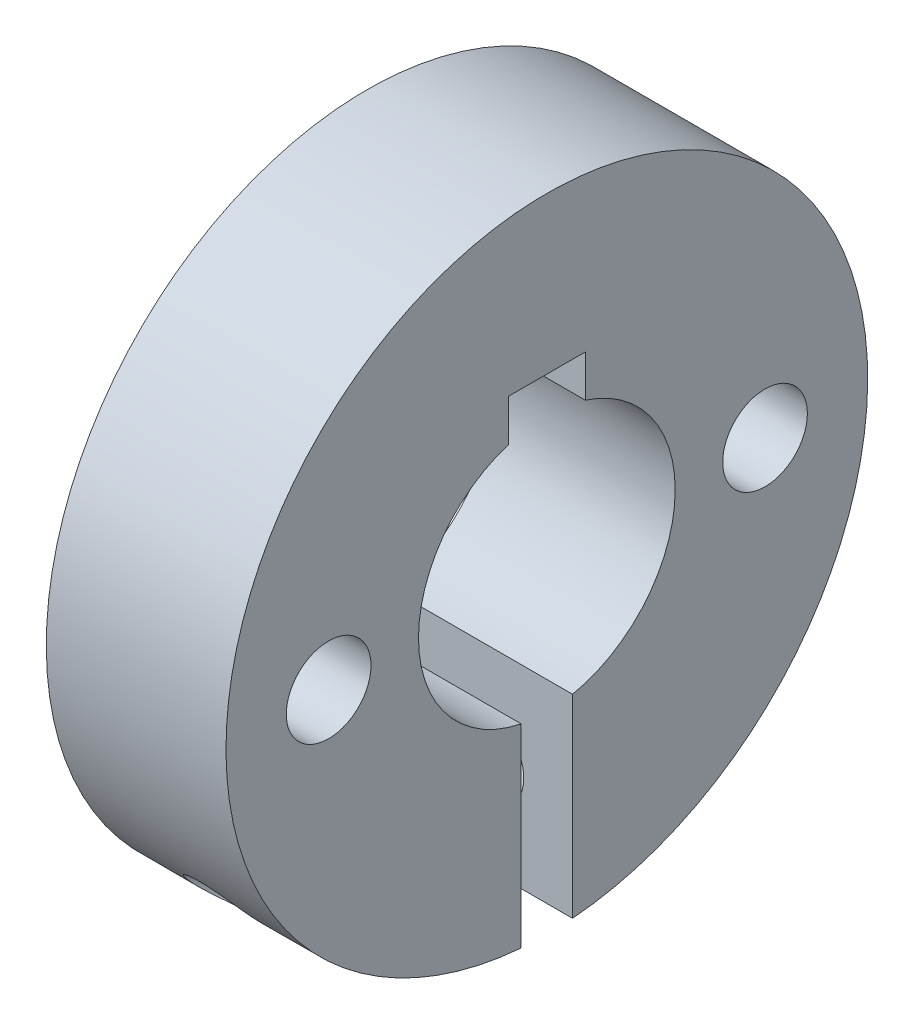
ISO-10303-21;
HEADER;
FILE_DESCRIPTION(('STEP AP214'),'2;1');
FILE_NAME('part.step','',(''),(''),'','','');
FILE_SCHEMA(('AUTOMOTIVE_DESIGN { 1 0 10303 214 1 1 1 1 }'));
ENDSEC;
DATA;
#1=APPLICATION_CONTEXT('core data for automotive mechanical design processes');
#2=APPLICATION_PROTOCOL_DEFINITION('international standard','automotive_design',2000,#1);
#3=PRODUCT_CONTEXT('',#1,'mechanical');
#4=PRODUCT('Part','Part','',(#3));
#5=PRODUCT_RELATED_PRODUCT_CATEGORY('part','',(#4));
#6=PRODUCT_DEFINITION_FORMATION('','',#4);
#7=PRODUCT_DEFINITION_CONTEXT('part definition',#1,'design');
#8=PRODUCT_DEFINITION('design','',#6,#7);
#9=PRODUCT_DEFINITION_SHAPE('','',#8);
#10=(LENGTH_UNIT() NAMED_UNIT(*) SI_UNIT(.MILLI.,.METRE.));
#11=(NAMED_UNIT(*) PLANE_ANGLE_UNIT() SI_UNIT($,.RADIAN.));
#12=(NAMED_UNIT(*) SI_UNIT($,.STERADIAN.) SOLID_ANGLE_UNIT());
#13=UNCERTAINTY_MEASURE_WITH_UNIT(LENGTH_MEASURE(1.E-05),#10,'distance_accuracy_value','');
#14=(GEOMETRIC_REPRESENTATION_CONTEXT(3) GLOBAL_UNCERTAINTY_ASSIGNED_CONTEXT((#13)) GLOBAL_UNIT_ASSIGNED_CONTEXT((#10,
#11,#12)) REPRESENTATION_CONTEXT('',''));
#15=CARTESIAN_POINT('',(0.,0.,0.));
#16=DIRECTION('',(0.,0.,1.));
#17=DIRECTION('',(1.,0.,0.));
#18=AXIS2_PLACEMENT_3D('',#15,#16,#17);
#19=CARTESIAN_POINT('',(7.,0.,0.));
#20=DIRECTION('',(-1.,0.,0.));
#21=DIRECTION('',(0.,0.,1.));
#22=AXIS2_PLACEMENT_3D('',#19,#20,#21);
#23=CYLINDRICAL_SURFACE('',#22,12.5);
#24=CARTESIAN_POINT('',(0.,0.,0.));
#25=DIRECTION('',(1.,0.,0.));
#26=DIRECTION('',(0.,0.,-1.));
#27=AXIS2_PLACEMENT_3D('',#24,#25,#26);
#28=CIRCLE('',#27,12.5);
#29=CARTESIAN_POINT('',(0.,-12.4599357943771,-0.999999999999999));
#30=VERTEX_POINT('',#29);
#31=CARTESIAN_POINT('',(0.,-12.4599357943771,0.999999999999999));
#32=VERTEX_POINT('',#31);
#33=EDGE_CURVE('E160',#30,#32,#28,.T.);
#34=ORIENTED_EDGE('',*,*,#33,.T.);
#35=DIRECTION('',(-1.,0.,0.));
#36=VECTOR('',#35,1.);
#37=CARTESIAN_POINT('',(7.,-12.4599357943771,0.999999999999999));
#38=LINE('',#37,#36);
#39=CARTESIAN_POINT('',(7.,-12.4599357943771,0.999999999999999));
#40=VERTEX_POINT('',#39);
#41=EDGE_CURVE('E194',#40,#32,#38,.T.);
#42=ORIENTED_EDGE('',*,*,#41,.F.);
#43=CARTESIAN_POINT('',(7.,0.,0.));
#44=DIRECTION('',(1.,0.,0.));
#45=DIRECTION('',(0.,0.,-1.));
#46=AXIS2_PLACEMENT_3D('',#43,#44,#45);
#47=CIRCLE('',#46,12.5);
#48=CARTESIAN_POINT('',(7.,-12.4599357943771,-0.999999999999999));
#49=VERTEX_POINT('',#48);
#50=EDGE_CURVE('E108',#49,#40,#47,.T.);
#51=ORIENTED_EDGE('',*,*,#50,.F.);
#52=DIRECTION('',(-1.,0.,0.));
#53=VECTOR('',#52,1.);
#54=CARTESIAN_POINT('',(7.,-12.4599357943771,-0.999999999999999));
#55=LINE('',#54,#53);
#56=EDGE_CURVE('E61',#49,#30,#55,.T.);
#57=ORIENTED_EDGE('',*,*,#56,.T.);
#58=EDGE_LOOP('',(#34,#42,#51,#57));
#59=FACE_BOUND('',#58,.T.);
#60=CARTESIAN_POINT('',(3.5,-7.42945763997174,10.0525200410576));
#61=CARTESIAN_POINT('',(3.55978288655646,-7.42946174926859,10.0525175539705));
#62=CARTESIAN_POINT('',(3.61963217176044,-7.43377704139792,10.0493321604696));
#63=CARTESIAN_POINT('',(3.7375099022843,-7.45077982129552,10.0367318387336));
#64=CARTESIAN_POINT('',(3.79553501221529,-7.4634818056489,10.0273061238871));
#65=CARTESIAN_POINT('',(3.90783155416965,-7.49641794010741,10.0027063484343));
#66=CARTESIAN_POINT('',(3.96211741626726,-7.51662095893979,9.98755604185876));
#67=CARTESIAN_POINT('',(4.06597548915851,-7.56347335897388,9.95212187338343));
#68=CARTESIAN_POINT('',(4.11554819738762,-7.59012205883134,9.93183855406107));
#69=CARTESIAN_POINT('',(4.21202940845868,-7.6504097578195,9.88548200179708));
#70=CARTESIAN_POINT('',(4.25860427714137,-7.68437016451983,9.85913622921956));
#71=CARTESIAN_POINT('',(4.34521100722974,-7.75679212282726,9.80226014095679));
#72=CARTESIAN_POINT('',(4.38523907163008,-7.79525626447128,9.77172741566727));
#73=CARTESIAN_POINT('',(4.47545045211327,-7.89379420771373,9.69245054201375));
#74=CARTESIAN_POINT('',(4.52192178754328,-7.95571395683625,9.64175797585985));
#75=CARTESIAN_POINT('',(4.60133790223953,-8.08344059613538,9.53493416339911));
#76=CARTESIAN_POINT('',(4.6342544086159,-8.14925528690175,9.47879184811337));
#77=CARTESIAN_POINT('',(4.69528660734983,-8.30209022028855,9.34549783292535));
#78=CARTESIAN_POINT('',(4.71914293700325,-8.38965414283765,9.26702345913546));
#79=CARTESIAN_POINT('',(4.74780659058197,-8.56409443836839,9.10606580568194));
#80=CARTESIAN_POINT('',(4.75259975091578,-8.65097025228923,9.02357959133269));
#81=CARTESIAN_POINT('',(4.74473645296879,-8.82333132551455,8.85514487455307));
#82=CARTESIAN_POINT('',(4.73178087671247,-8.90876756928098,8.769161311379));
#83=CARTESIAN_POINT('',(4.68885515944151,-9.07506465388522,8.59694874723722));
#84=CARTESIAN_POINT('',(4.65887897031244,-9.15592385707703,8.51071966987137));
#85=CARTESIAN_POINT('',(4.58484418854808,-9.30560108013872,8.34668729162403));
#86=CARTESIAN_POINT('',(4.54201506503065,-9.37486732858103,8.26873823501817));
#87=CARTESIAN_POINT('',(4.44095566346468,-9.50648911174479,8.11705986168358));
#88=CARTESIAN_POINT('',(4.3827547109875,-9.56885748780057,8.04332283184793));
#89=CARTESIAN_POINT('',(4.27493822008901,-9.6617476182039,7.93118783312109));
#90=CARTESIAN_POINT('',(4.23067301002884,-9.6952728524093,7.89013110944064));
#91=CARTESIAN_POINT('',(4.13507459235188,-9.75761795383695,7.81289532972786));
#92=CARTESIAN_POINT('',(4.08375129602232,-9.78644429754424,7.77670957223794));
#93=CARTESIAN_POINT('',(3.98664145118125,-9.83177665517521,7.71927360404097));
#94=CARTESIAN_POINT('',(3.94237079939095,-9.8495871325264,7.69650999670815));
#95=CARTESIAN_POINT('',(3.84976080595717,-9.8805150969743,7.65676541962036));
#96=CARTESIAN_POINT('',(3.80142771813453,-9.89363963998585,7.63977575753488));
#97=CARTESIAN_POINT('',(3.70977334067508,-9.91246650440011,7.61532718675962));
#98=CARTESIAN_POINT('',(3.66692838428134,-9.91903258335952,7.60676280945789));
#99=CARTESIAN_POINT('',(3.58003005183938,-9.92765510116527,7.59550636327891));
#100=CARTESIAN_POINT('',(3.53597752981058,-9.9297146478674,7.59281024745851));
#101=CARTESIAN_POINT('',(3.44791665251177,-9.92914875239561,7.59355022664115));
#102=CARTESIAN_POINT('',(3.40390837064834,-9.92651916946234,7.59699174150993));
#103=CARTESIAN_POINT('',(3.31724446589245,-9.91679629295766,7.6096788834808));
#104=CARTESIAN_POINT('',(3.27458985918574,-9.90969972562147,7.61892876741003));
#105=CARTESIAN_POINT('',(3.18147013522758,-9.88934591704355,7.64533679304274));
#106=CARTESIAN_POINT('',(3.1316361394873,-9.87500851224983,7.66387316950391));
#107=CARTESIAN_POINT('',(3.03643320370526,-9.84142483243998,7.70695166744678));
#108=CARTESIAN_POINT('',(2.99107263275756,-9.82216958965518,7.73150475716501));
#109=CARTESIAN_POINT('',(2.88531666302246,-9.77012496921136,7.79724992582086));
#110=CARTESIAN_POINT('',(2.82753775794119,-9.73517407189214,7.84091507827152));
#111=CARTESIAN_POINT('',(2.72127066111284,-9.65943348347553,7.93403968968654));
#112=CARTESIAN_POINT('',(2.67280394162761,-9.61863066810989,7.98351212628427));
#113=CARTESIAN_POINT('',(2.56195558794513,-9.51085167006384,8.11195325938806));
#114=CARTESIAN_POINT('',(2.50492900055234,-9.44107306209932,8.19318808229886));
#115=CARTESIAN_POINT('',(2.40815363009991,-9.29435080126215,8.35927073341215));
#116=CARTESIAN_POINT('',(2.36842522614781,-9.21739882621995,8.44412269453566));
#117=CARTESIAN_POINT('',(2.30460753852405,-9.05542611491993,8.61764399098021));
#118=CARTESIAN_POINT('',(2.28107155477115,-8.97022391087228,8.70634747813004));
#119=CARTESIAN_POINT('',(2.25228197462219,-8.79569898398609,8.88262587769882));
#120=CARTESIAN_POINT('',(2.24701841346484,-8.70637853394938,8.97020137928757));
#121=CARTESIAN_POINT('',(2.2557487894639,-8.53460099032578,9.13363175878933));
#122=CARTESIAN_POINT('',(2.26788613799476,-8.45234085574142,9.20978813054695));
#123=CARTESIAN_POINT('',(2.30977755928658,-8.28828090724059,9.35769912865113));
#124=CARTESIAN_POINT('',(2.33951182282192,-8.20648067996324,9.4294586045935));
#125=CARTESIAN_POINT('',(2.40910166645136,-8.06537671091504,9.55019476949637));
#126=CARTESIAN_POINT('',(2.44494930973338,-8.00529535839433,9.60056822444147));
#127=CARTESIAN_POINT('',(2.52868383100547,-7.88943503079477,9.69600001800548));
#128=CARTESIAN_POINT('',(2.57655352257853,-7.83365006121943,9.74106581036351));
#129=CARTESIAN_POINT('',(2.67427907735116,-7.73903570991941,9.81632689502286));
#130=CARTESIAN_POINT('',(2.722035025575,-7.69899743959591,9.84772132475541));
#131=CARTESIAN_POINT('',(2.82529918590666,-7.62527730560836,9.90491403215343));
#132=CARTESIAN_POINT('',(2.88080825013546,-7.59159614159225,9.93071169389863));
#133=CARTESIAN_POINT('',(2.99911912702812,-7.53227156538459,9.97578538225892));
#134=CARTESIAN_POINT('',(3.0619801008126,-7.50670051606314,9.99500281089431));
#135=CARTESIAN_POINT('',(3.19269727986514,-7.46590079840333,10.0255169073047));
#136=CARTESIAN_POINT('',(3.26053875862701,-7.45064290101185,10.0368359632539));
#137=CARTESIAN_POINT('',(3.35765474427614,-7.43726072961347,10.0467492076957));
#138=CARTESIAN_POINT('',(3.38599620704282,-7.43434044308542,10.0489097785977));
#139=CARTESIAN_POINT('',(3.44288672788949,-7.43043792199914,10.0517957854115));
#140=CARTESIAN_POINT('',(3.47143578480231,-7.429455676553,10.0525212293859));
#141=CARTESIAN_POINT('',(3.5,-7.42945763997174,10.0525200410576));
#142=B_SPLINE_CURVE_WITH_KNOTS('',3,(#60,#61,#62,#63,#64,#65,#66,#67,#68,#69,#70,#71,#72,#73,
#74,#75,#76,#77,#78,#79,#80,#81,#82,#83,#84,#85,#86,#87,#88,#89,#90,#91,#92,#93,#94,#95,#96,#97,
#98,#99,#100,#101,#102,#103,#104,#105,#106,#107,#108,#109,#110,#111,#112,#113,#114,#115,#116,
#117,#118,#119,#120,#121,#122,#123,#124,#125,#126,#127,#128,#129,#130,#131,#132,#133,#134,#135,
#136,#137,#138,#139,#140,#141),.UNSPECIFIED.,.T.,.F.,(4,2,2,2,2,2,2,2,2,2,2,2,2,2,2,2,2,2,2,2,2,
2,2,2,2,2,2,2,2,2,2,2,2,2,2,2,2,2,2,2,4),(0.,0.179230290482701,0.358771198428062,
0.537575145236119,0.716360199728705,0.905774907293353,1.09529908470666,1.37138638168006,
1.64804666439201,2.00607658725406,2.36437247026247,2.72878154141975,3.09332018301639,
3.43042677798601,3.76689484657101,3.97355486927007,4.17992759873487,4.33799529664892,
4.49582396789321,4.62779348215124,4.7596719570842,4.8916669456389,5.02375878352867,
5.1880546186204,5.35265221632924,5.59255742107611,5.83300933542669,6.19503931646268,
6.55749466100065,6.93179075746442,7.30588270159683,7.64290494830016,7.97954852156055,
8.23725766093497,8.49460046233357,8.70311900979325,8.91166049294137,9.12201350837459,
9.33176782291982,9.41740439291788,9.50304048180861),.UNSPECIFIED.);
#143=CARTESIAN_POINT('',(3.5,-7.42945763997174,10.0525200410576));
#144=VERTEX_POINT('',#143);
#145=EDGE_CURVE('E161',#144,#144,#142,.T.);
#146=ORIENTED_EDGE('',*,*,#145,.T.);
#147=EDGE_LOOP('',(#146));
#148=FACE_BOUND('',#147,.T.);
#149=CARTESIAN_POINT('',(0.715906380479176,-10.356157588604,-7.));
#150=CARTESIAN_POINT('',(0.79347571941945,-10.4849639310159,-6.8094360780036));
#151=CARTESIAN_POINT('',(0.879114227203295,-10.6069898437073,-6.61755772542862));
#152=CARTESIAN_POINT('',(1.06545459258734,-10.8375851963992,-6.23274193363524));
#153=CARTESIAN_POINT('',(1.16617051017682,-10.9461419014321,-6.03980366953908));
#154=CARTESIAN_POINT('',(1.3285441705624,-11.0987070902661,-5.75156740005704));
#155=CARTESIAN_POINT('',(1.3845235469849,-11.1478301769075,-5.65572784917471));
#156=CARTESIAN_POINT('',(1.50047652009421,-11.2426629423502,-5.4647855329156));
#157=CARTESIAN_POINT('',(1.56044954124828,-11.288373110989,-5.36968266356976));
#158=CARTESIAN_POINT('',(1.68466070415561,-11.3762751946078,-5.18084894386103));
#159=CARTESIAN_POINT('',(1.74889302363027,-11.4184717414562,-5.08711642592867));
#160=CARTESIAN_POINT('',(1.88226803692957,-11.4993035128446,-4.90165614225973));
#161=CARTESIAN_POINT('',(1.95140887156713,-11.5379400731849,-4.8099276345035));
#162=CARTESIAN_POINT('',(2.07155293982641,-11.5992082250827,-4.65967704624451));
#163=CARTESIAN_POINT('',(2.12092312121191,-11.6228830394903,-4.60027481895072));
#164=CARTESIAN_POINT('',(2.22272235608929,-11.6684668723083,-4.48339290348587));
#165=CARTESIAN_POINT('',(2.2751523114519,-11.6903753655164,-4.42591379008868));
#166=CARTESIAN_POINT('',(2.3833954924213,-11.7321693269231,-4.31390315304787));
#167=CARTESIAN_POINT('',(2.43919450652841,-11.7520624586327,-4.259360863849));
#168=CARTESIAN_POINT('',(2.55503832777676,-11.7896432977134,-4.15420497331732));
#169=CARTESIAN_POINT('',(2.61507921193539,-11.807333002085,-4.10358783050333));
#170=CARTESIAN_POINT('',(2.73420525727115,-11.8384875657718,-4.01276563717934));
#171=CARTESIAN_POINT('',(2.79281302168225,-11.8521961714603,-3.97202659616494));
#172=CARTESIAN_POINT('',(2.91485706992919,-11.8769532811491,-3.89737403328445));
#173=CARTESIAN_POINT('',(2.97829189504498,-11.888002584612,-3.86345846059204));
#174=CARTESIAN_POINT('',(3.10035779486694,-11.9052901513401,-3.80982234696773));
#175=CARTESIAN_POINT('',(3.15831019911782,-11.9119984410477,-3.78874378369629));
#176=CARTESIAN_POINT('',(3.27706711920764,-11.922347426304,-3.75605290454492));
#177=CARTESIAN_POINT('',(3.33786568374252,-11.9259942452638,-3.74442169403095));
#178=CARTESIAN_POINT('',(3.46118169662115,-11.9298139921817,-3.73223621294534));
#179=CARTESIAN_POINT('',(3.52370855949574,-11.9299609095258,-3.73176488065797));
#180=CARTESIAN_POINT('',(3.64772265566325,-11.9266933127436,-3.74219319427329));
#181=CARTESIAN_POINT('',(3.70920878035131,-11.9232752173249,-3.75310427456868));
#182=CARTESIAN_POINT('',(3.84024019446919,-11.9123853748738,-3.78753824982327));
#183=CARTESIAN_POINT('',(3.90920727304114,-11.9042874587995,-3.81300007514748));
#184=CARTESIAN_POINT('',(4.04209988578555,-11.8846367505705,-3.87381232771624));
#185=CARTESIAN_POINT('',(4.10601220123495,-11.8730752553772,-3.909187650272));
#186=CARTESIAN_POINT('',(4.22412054495863,-11.8482901139786,-3.98364673837871));
#187=CARTESIAN_POINT('',(4.27868559421665,-11.8352665490465,-4.02222577336096));
#188=CARTESIAN_POINT('',(4.38419956120878,-11.8073429438414,-4.10347520585009));
#189=CARTESIAN_POINT('',(4.435145044631,-11.7924411576966,-4.14614940102825));
#190=CARTESIAN_POINT('',(4.58357285531443,-11.7452716024096,-4.27870846663501));
#191=CARTESIAN_POINT('',(4.6763775176154,-11.7106001649552,-4.37294428753463));
#192=CARTESIAN_POINT('',(4.86859874248035,-11.6294005548317,-4.58499835278535));
#193=CARTESIAN_POINT('',(4.96621300744872,-11.5818611972887,-4.70401374548951));
#194=CARTESIAN_POINT('',(5.15196775562082,-11.4802942724629,-4.94673675331749));
#195=CARTESIAN_POINT('',(5.24009705171786,-11.4262591993242,-5.070449681389));
#196=CARTESIAN_POINT('',(5.40840997976859,-11.3120981016482,-5.32027249000751));
#197=CARTESIAN_POINT('',(5.48859870303995,-11.2519760306366,-5.44638077206397));
#198=CARTESIAN_POINT('',(5.64198918298083,-11.1257283176728,-5.69984496155417));
#199=CARTESIAN_POINT('',(5.71518981577688,-11.0596017133552,-5.82720106605201));
#200=CARTESIAN_POINT('',(5.8806877899506,-10.8959670258562,-6.12921291862304));
#201=CARTESIAN_POINT('',(5.97011318889783,-10.795858936385,-6.30404600407491));
#202=CARTESIAN_POINT('',(6.13660857598588,-10.5844233754347,-6.65294162027726));
#203=CARTESIAN_POINT('',(6.21367263953213,-10.4730905655056,-6.82700374288595));
#204=CARTESIAN_POINT('',(6.35177895545045,-10.2437671074702,-7.16627587090113));
#205=CARTESIAN_POINT('',(6.41332731059465,-10.1262031076222,-7.33156707918228));
#206=CARTESIAN_POINT('',(6.52281833631827,-9.88076331706737,-7.65913985857571));
#207=CARTESIAN_POINT('',(6.57075482662088,-9.75288287605373,-7.82142003141527));
#208=CARTESIAN_POINT('',(6.65106480836704,-9.48724489939785,-8.14158354745148));
#209=CARTESIAN_POINT('',(6.6834491130336,-9.34949430314367,-8.29946987346776));
#210=CARTESIAN_POINT('',(6.73028341826971,-9.06489954867702,-8.60940646452126));
#211=CARTESIAN_POINT('',(6.74474719856136,-8.9180624687207,-8.76146112643365));
#212=CARTESIAN_POINT('',(6.75374233284892,-8.58449012501608,-9.08966053032231));
#213=CARTESIAN_POINT('',(6.74342809503479,-8.39587021316865,-9.26412494928299));
#214=CARTESIAN_POINT('',(6.70078698871932,-8.10773275592281,-9.51477598244882));
#215=CARTESIAN_POINT('',(6.68205920481545,-8.01086278011715,-9.5964518762225));
#216=CARTESIAN_POINT('',(6.63484617075079,-7.81615613511896,-9.75569199092036));
#217=CARTESIAN_POINT('',(6.60636240577516,-7.71831961526695,-9.83325683560889));
#218=CARTESIAN_POINT('',(6.51676916315662,-7.45844353730649,-10.0331017541932));
#219=CARTESIAN_POINT('',(6.44650737009962,-7.29628807996397,-10.1514261578856));
#220=CARTESIAN_POINT('',(6.31792092480426,-7.05772326291356,-10.3173667133299));
#221=CARTESIAN_POINT('',(6.2711619118288,-6.97893881412853,-10.3707813757542));
#222=CARTESIAN_POINT('',(6.16976808784171,-6.82381550856341,-10.4734977709732));
#223=CARTESIAN_POINT('',(6.11513732729465,-6.74747541856254,-10.5228015985552));
#224=CARTESIAN_POINT('',(5.99748150790964,-6.59757272963097,-10.6174370636955));
#225=CARTESIAN_POINT('',(5.93438827556639,-6.52403967587522,-10.6627308790155));
#226=CARTESIAN_POINT('',(5.80037353392708,-6.3815587937478,-10.7486102313954));
#227=CARTESIAN_POINT('',(5.72945601267025,-6.31260865791973,-10.7891981456137));
#228=CARTESIAN_POINT('',(5.58014317064352,-6.18036838978649,-10.8654901339185));
#229=CARTESIAN_POINT('',(5.50174998258859,-6.11707665313437,-10.9011955938755));
#230=CARTESIAN_POINT('',(5.33802039965768,-5.99720676048871,-10.9675980943094));
#231=CARTESIAN_POINT('',(5.25268520080322,-5.94062745213982,-10.9982959947986));
#232=CARTESIAN_POINT('',(5.08815445658085,-5.84253715543178,-11.0506745146717));
#233=CARTESIAN_POINT('',(5.00976347782673,-5.80002520034724,-11.0730156662818));
#234=CARTESIAN_POINT('',(4.8489155386437,-5.72125748740897,-11.1139184443795));
#235=CARTESIAN_POINT('',(4.76645726408655,-5.6850037688188,-11.1324788392506));
#236=CARTESIAN_POINT('',(4.59820179605341,-5.61929446776873,-11.1657910795414));
#237=CARTESIAN_POINT('',(4.51240728342034,-5.5898335536625,-11.1805459130183));
#238=CARTESIAN_POINT('',(4.3381255834925,-5.53806831592891,-11.2062761029865));
#239=CARTESIAN_POINT('',(4.2496374672943,-5.51576649247639,-11.2172501392049));
#240=CARTESIAN_POINT('',(3.9957723438197,-5.46312310043207,-11.2430339136334));
#241=CARTESIAN_POINT('',(3.82797988145904,-5.44165505392729,-11.2533765726616));
#242=CARTESIAN_POINT('',(3.49091402445433,-5.42508750353382,-11.2613720659369));
#243=CARTESIAN_POINT('',(3.32164098585682,-5.42998182516045,-11.2590278716455));
#244=CARTESIAN_POINT('',(2.99043215235368,-5.46543808271563,-11.2418571308996));
#245=CARTESIAN_POINT('',(2.82841723578411,-5.49540225442743,-11.2273212623124));
#246=CARTESIAN_POINT('',(2.51222542758918,-5.57888628807904,-11.1860705681646));
#247=CARTESIAN_POINT('',(2.35804817915064,-5.63240507661171,-11.1593562975839));
#248=CARTESIAN_POINT('',(2.0603129655649,-5.76118181851466,-11.0934227984173));
#249=CARTESIAN_POINT('',(1.91685807015789,-5.83662330511915,-11.0540976936244));
#250=CARTESIAN_POINT('',(1.64547687620747,-6.00572973162655,-10.9631381595828));
#251=CARTESIAN_POINT('',(1.51755225038437,-6.09939663171304,-10.9115024061618));
#252=CARTESIAN_POINT('',(1.27442846853792,-6.305467715642,-10.7937818088803));
#253=CARTESIAN_POINT('',(1.16003549154584,-6.41851438608942,-10.7271617519652));
#254=CARTESIAN_POINT('',(0.952271905730735,-6.65549003745732,-10.5817661507352));
#255=CARTESIAN_POINT('',(0.858906614363124,-6.7794217599881,-10.502987540249));
#256=CARTESIAN_POINT('',(0.68513754406606,-7.04639633920461,-10.3260061508724));
#257=CARTESIAN_POINT('',(0.606955690721397,-7.19011239883077,-10.226649660437));
#258=CARTESIAN_POINT('',(0.47510589525642,-7.48030795178657,-10.0163433684595));
#259=CARTESIAN_POINT('',(0.421456593317924,-7.62678945864233,-9.9053848299024));
#260=CARTESIAN_POINT('',(0.347593493002063,-7.88097079415301,-9.70358271136463));
#261=CARTESIAN_POINT('',(0.322331615330954,-7.9889710196087,-9.61488972844366));
#262=CARTESIAN_POINT('',(0.283250983673566,-8.20314260500007,-9.43282552453337));
#263=CARTESIAN_POINT('',(0.269436643254899,-8.30931324411015,-9.33945251387154));
#264=CARTESIAN_POINT('',(0.252259125874545,-8.51896627205994,-9.14862495710288));
#265=CARTESIAN_POINT('',(0.248907368940249,-8.62244560126541,-9.05116606867595));
#266=CARTESIAN_POINT('',(0.251708688048735,-8.82595913749987,-8.85283270471409));
#267=CARTESIAN_POINT('',(0.257864152075369,-8.92599247252625,-8.75195737727741));
#268=CARTESIAN_POINT('',(0.281642472814555,-9.1489930375392,-8.51930193839648));
#269=CARTESIAN_POINT('',(0.301943969902885,-9.27073916036144,-8.38662332767934));
#270=CARTESIAN_POINT('',(0.354850912990131,-9.50724230785035,-8.11754014683597));
#271=CARTESIAN_POINT('',(0.387459804537605,-9.62199736485663,-7.98113454323874));
#272=CARTESIAN_POINT('',(0.463681018685927,-9.84441190030902,-7.70513048308187));
#273=CARTESIAN_POINT('',(0.507318154565076,-9.95205467800057,-7.5655254807959));
#274=CARTESIAN_POINT('',(0.60443643081566,-10.1597801320075,-7.28419170754691));
#275=CARTESIAN_POINT('',(0.657916529953154,-10.2598636064029,-7.14246316267737));
#276=CARTESIAN_POINT('',(0.715906380479176,-10.356157588604,-7.));
#277=B_SPLINE_CURVE_WITH_KNOTS('',3,(#149,#150,#151,#152,#153,#154,#155,#156,#157,#158,#159,
#160,#161,#162,#163,#164,#165,#166,#167,#168,#169,#170,#171,#172,#173,#174,#175,#176,#177,#178,
#179,#180,#181,#182,#183,#184,#185,#186,#187,#188,#189,#190,#191,#192,#193,#194,#195,#196,#197,
#198,#199,#200,#201,#202,#203,#204,#205,#206,#207,#208,#209,#210,#211,#212,#213,#214,#215,#216,
#217,#218,#219,#220,#221,#222,#223,#224,#225,#226,#227,#228,#229,#230,#231,#232,#233,#234,#235,
#236,#237,#238,#239,#240,#241,#242,#243,#244,#245,#246,#247,#248,#249,#250,#251,#252,#253,#254,
#255,#256,#257,#258,#259,#260,#261,#262,#263,#264,#265,#266,#267,#268,#269,#270,#271,#272,#273,
#274,#275,#276),.UNSPECIFIED.,.T.,.F.,(4,2,2,2,2,2,2,2,2,2,2,2,2,2,2,2,2,2,2,2,2,2,2,2,2,2,2,2,
2,2,2,2,2,2,2,2,2,2,2,2,2,2,2,2,2,2,2,2,2,2,2,2,2,2,2,2,2,2,2,2,2,2,2,4),(0.,0.728057558935906,
1.45679832486738,1.82083241906029,2.18481416457924,2.54830822970694,2.91166534211385,
3.15394756558886,3.39630156619656,3.63769638322076,3.87887080337769,4.09653484282755,
4.31413336424747,4.49952498259802,4.68454489975767,4.87093942478619,5.05752137602643,
5.27816926712885,5.49937630459202,5.70332323497106,5.90746115887548,6.31672473447687,
6.79943494025892,7.28270838245376,7.76566992641712,8.24870901323374,8.90931756109835,
9.57024178830179,10.2054910897099,10.8410283576706,11.4761231031598,12.1107291982555,
12.8791374296577,13.2630038263927,13.6468118118347,14.2817904778067,14.5996201240857,
14.9172868090056,15.2376864088655,15.5579234490161,15.8780694012824,16.1981603127529,
16.4735912244917,16.7491117174247,17.0244152135646,17.2998147498266,17.8055244914848,
18.3111157930529,18.8049843810883,19.2988304653741,19.796936309821,20.2950957562961,
20.8151450520335,21.3353257099083,21.9073947874947,22.4798978119994,22.9054003823637,
23.3310669278887,23.7571979310547,24.1834359854249,24.7263949436425,25.2695060202316,
25.8138501350839,26.3581366997733),.UNSPECIFIED.);
#278=CARTESIAN_POINT('',(0.715906380479176,-10.356157588604,-7.));
#279=VERTEX_POINT('',#278);
#280=EDGE_CURVE('E11',#279,#279,#277,.T.);
#281=ORIENTED_EDGE('',*,*,#280,.T.);
#282=EDGE_LOOP('',(#281));
#283=FACE_BOUND('',#282,.T.);
#284=ADVANCED_FACE('F47',(#59,#148,#283),#23,.T.);
#285=CARTESIAN_POINT('',(7.,0.,-1.));
#286=DIRECTION('',(0.,0.,-1.));
#287=DIRECTION('',(0.,1.,0.));
#288=AXIS2_PLACEMENT_3D('',#285,#286,#287);
#289=PLANE('',#288);
#290=CARTESIAN_POINT('',(3.5,-8.67945763997173,-1.));
#291=DIRECTION('',(0.,0.,-1.));
#292=DIRECTION('',(0.,1.,0.));
#293=AXIS2_PLACEMENT_3D('',#290,#291,#292);
#294=CIRCLE('',#293,1.6);
#295=CARTESIAN_POINT('',(3.5,-7.07945763997173,-1.));
#296=VERTEX_POINT('',#295);
#297=EDGE_CURVE('E283',#296,#296,#294,.F.);
#298=ORIENTED_EDGE('',*,*,#297,.F.);
#299=EDGE_LOOP('',(#298));
#300=FACE_BOUND('',#299,.T.);
#301=DIRECTION('',(0.,-1.,0.));
#302=VECTOR('',#301,1.);
#303=CARTESIAN_POINT('',(0.,0.,-1.));
#304=LINE('',#303,#302);
#305=CARTESIAN_POINT('',(0.,-4.89897948556636,-1.));
#306=VERTEX_POINT('',#305);
#307=EDGE_CURVE('E157',#306,#30,#304,.T.);
#308=ORIENTED_EDGE('',*,*,#307,.T.);
#309=ORIENTED_EDGE('',*,*,#56,.F.);
#310=DIRECTION('',(0.,-1.,0.));
#311=VECTOR('',#310,1.);
#312=CARTESIAN_POINT('',(7.,0.,-1.));
#313=LINE('',#312,#311);
#314=CARTESIAN_POINT('',(7.,-4.89897948556636,-1.));
#315=VERTEX_POINT('',#314);
#316=EDGE_CURVE('E293',#315,#49,#313,.T.);
#317=ORIENTED_EDGE('',*,*,#316,.F.);
#318=DIRECTION('',(-1.,0.,0.));
#319=VECTOR('',#318,1.);
#320=CARTESIAN_POINT('',(7.,-4.89897948556636,-1.));
#321=LINE('',#320,#319);
#322=EDGE_CURVE('E69',#315,#306,#321,.T.);
#323=ORIENTED_EDGE('',*,*,#322,.T.);
#324=EDGE_LOOP('',(#308,#309,#317,#323));
#325=FACE_BOUND('',#324,.T.);
#326=ADVANCED_FACE('F49',(#300,#325),#289,.F.);
#327=CARTESIAN_POINT('',(7.,0.,1.));
#328=DIRECTION('',(0.,0.,-1.));
#329=DIRECTION('',(0.,1.,0.));
#330=AXIS2_PLACEMENT_3D('',#327,#328,#329);
#331=PLANE('',#330);
#332=CARTESIAN_POINT('',(3.5,-8.67945763997174,1.));
#333=DIRECTION('',(0.,0.,-1.));
#334=DIRECTION('',(0.,1.,0.));
#335=AXIS2_PLACEMENT_3D('',#332,#333,#334);
#336=CIRCLE('',#335,1.25);
#337=CARTESIAN_POINT('',(3.5,-7.42945763997174,1.));
#338=VERTEX_POINT('',#337);
#339=EDGE_CURVE('E204',#338,#338,#336,.T.);
#340=ORIENTED_EDGE('',*,*,#339,.F.);
#341=EDGE_LOOP('',(#340));
#342=FACE_BOUND('',#341,.T.);
#343=DIRECTION('',(0.,-1.,0.));
#344=VECTOR('',#343,1.);
#345=CARTESIAN_POINT('',(0.,0.,1.));
#346=LINE('',#345,#344);
#347=CARTESIAN_POINT('',(0.,-4.89897948556636,1.));
#348=VERTEX_POINT('',#347);
#349=EDGE_CURVE('E165',#348,#32,#346,.T.);
#350=ORIENTED_EDGE('',*,*,#349,.F.);
#351=DIRECTION('',(-1.,0.,0.));
#352=VECTOR('',#351,1.);
#353=CARTESIAN_POINT('',(7.,-4.89897948556636,1.));
#354=LINE('',#353,#352);
#355=CARTESIAN_POINT('',(7.,-4.89897948556636,1.));
#356=VERTEX_POINT('',#355);
#357=EDGE_CURVE('E191',#356,#348,#354,.T.);
#358=ORIENTED_EDGE('',*,*,#357,.F.);
#359=DIRECTION('',(0.,-1.,0.));
#360=VECTOR('',#359,1.);
#361=CARTESIAN_POINT('',(7.,0.,1.));
#362=LINE('',#361,#360);
#363=EDGE_CURVE('E298',#356,#40,#362,.T.);
#364=ORIENTED_EDGE('',*,*,#363,.T.);
#365=ORIENTED_EDGE('',*,*,#41,.T.);
#366=EDGE_LOOP('',(#350,#358,#364,#365));
#367=FACE_BOUND('',#366,.T.);
#368=ADVANCED_FACE('F234',(#342,#367),#331,.T.);
#369=CARTESIAN_POINT('',(7.,0.,0.));
#370=DIRECTION('',(-1.,0.,0.));
#371=DIRECTION('',(0.,0.,1.));
#372=AXIS2_PLACEMENT_3D('',#369,#370,#371);
#373=CYLINDRICAL_SURFACE('',#372,5.);
#374=CARTESIAN_POINT('',(0.,0.,0.));
#375=DIRECTION('',(1.,0.,0.));
#376=DIRECTION('',(0.,0.,-1.));
#377=AXIS2_PLACEMENT_3D('',#374,#375,#376);
#378=CIRCLE('',#377,5.);
#379=CARTESIAN_POINT('',(0.,4.76969600708473,1.5));
#380=VERTEX_POINT('',#379);
#381=EDGE_CURVE('E169',#380,#348,#378,.T.);
#382=ORIENTED_EDGE('',*,*,#381,.F.);
#383=DIRECTION('',(-1.,0.,0.));
#384=VECTOR('',#383,1.);
#385=CARTESIAN_POINT('',(7.,4.76969600708473,1.5));
#386=LINE('',#385,#384);
#387=CARTESIAN_POINT('',(7.,4.76969600708473,1.5));
#388=VERTEX_POINT('',#387);
#389=EDGE_CURVE('E188',#388,#380,#386,.T.);
#390=ORIENTED_EDGE('',*,*,#389,.F.);
#391=CARTESIAN_POINT('',(7.,0.,0.));
#392=DIRECTION('',(1.,0.,0.));
#393=DIRECTION('',(0.,0.,-1.));
#394=AXIS2_PLACEMENT_3D('',#391,#392,#393);
#395=CIRCLE('',#394,5.);
#396=EDGE_CURVE('E154',#388,#356,#395,.T.);
#397=ORIENTED_EDGE('',*,*,#396,.T.);
#398=ORIENTED_EDGE('',*,*,#357,.T.);
#399=EDGE_LOOP('',(#382,#390,#397,#398));
#400=FACE_BOUND('',#399,.T.);
#401=ADVANCED_FACE('F226',(#400),#373,.F.);
#402=CARTESIAN_POINT('',(7.,0.,1.5));
#403=DIRECTION('',(0.,0.,1.));
#404=DIRECTION('',(0.,-1.,0.));
#405=AXIS2_PLACEMENT_3D('',#402,#403,#404);
#406=PLANE('',#405);
#407=DIRECTION('',(0.,1.,0.));
#408=VECTOR('',#407,1.);
#409=CARTESIAN_POINT('',(0.,0.,1.5));
#410=LINE('',#409,#408);
#411=CARTESIAN_POINT('',(0.,6.4,1.5));
#412=VERTEX_POINT('',#411);
#413=EDGE_CURVE('E173',#380,#412,#410,.T.);
#414=ORIENTED_EDGE('',*,*,#413,.T.);
#415=DIRECTION('',(-1.,0.,0.));
#416=VECTOR('',#415,1.);
#417=CARTESIAN_POINT('',(7.,6.4,1.5));
#418=LINE('',#417,#416);
#419=CARTESIAN_POINT('',(7.,6.4,1.5));
#420=VERTEX_POINT('',#419);
#421=EDGE_CURVE('E146',#420,#412,#418,.T.);
#422=ORIENTED_EDGE('',*,*,#421,.F.);
#423=DIRECTION('',(0.,1.,0.));
#424=VECTOR('',#423,1.);
#425=CARTESIAN_POINT('',(7.,0.,1.5));
#426=LINE('',#425,#424);
#427=EDGE_CURVE('E132',#388,#420,#426,.T.);
#428=ORIENTED_EDGE('',*,*,#427,.F.);
#429=ORIENTED_EDGE('',*,*,#389,.T.);
#430=EDGE_LOOP('',(#414,#422,#428,#429));
#431=FACE_BOUND('',#430,.T.);
#432=ADVANCED_FACE('F231',(#431),#406,.F.);
#433=CARTESIAN_POINT('',(7.,6.4,0.));
#434=DIRECTION('',(0.,1.,0.));
#435=DIRECTION('',(0.,0.,1.));
#436=AXIS2_PLACEMENT_3D('',#433,#434,#435);
#437=PLANE('',#436);
#438=DIRECTION('',(0.,0.,-1.));
#439=VECTOR('',#438,1.);
#440=CARTESIAN_POINT('',(0.,6.4,0.));
#441=LINE('',#440,#439);
#442=CARTESIAN_POINT('',(0.,6.4,-1.5));
#443=VERTEX_POINT('',#442);
#444=EDGE_CURVE('E142',#412,#443,#441,.T.);
#445=ORIENTED_EDGE('',*,*,#444,.T.);
#446=DIRECTION('',(-1.,0.,0.));
#447=VECTOR('',#446,1.);
#448=CARTESIAN_POINT('',(7.,6.4,-1.5));
#449=LINE('',#448,#447);
#450=CARTESIAN_POINT('',(7.,6.4,-1.5));
#451=VERTEX_POINT('',#450);
#452=EDGE_CURVE('E139',#451,#443,#449,.T.);
#453=ORIENTED_EDGE('',*,*,#452,.F.);
#454=DIRECTION('',(0.,0.,-1.));
#455=VECTOR('',#454,1.);
#456=CARTESIAN_POINT('',(7.,6.4,0.));
#457=LINE('',#456,#455);
#458=EDGE_CURVE('E124',#420,#451,#457,.T.);
#459=ORIENTED_EDGE('',*,*,#458,.F.);
#460=ORIENTED_EDGE('',*,*,#421,.T.);
#461=EDGE_LOOP('',(#445,#453,#459,#460));
#462=FACE_BOUND('',#461,.T.);
#463=ADVANCED_FACE('F140',(#462),#437,.F.);
#464=CARTESIAN_POINT('',(7.,0.,-1.5));
#465=DIRECTION('',(0.,0.,1.));
#466=DIRECTION('',(0.,-1.,0.));
#467=AXIS2_PLACEMENT_3D('',#464,#465,#466);
#468=PLANE('',#467);
#469=DIRECTION('',(0.,1.,0.));
#470=VECTOR('',#469,1.);
#471=CARTESIAN_POINT('',(0.,0.,-1.5));
#472=LINE('',#471,#470);
#473=CARTESIAN_POINT('',(0.,4.76969600708473,-1.5));
#474=VERTEX_POINT('',#473);
#475=EDGE_CURVE('E179',#474,#443,#472,.T.);
#476=ORIENTED_EDGE('',*,*,#475,.F.);
#477=DIRECTION('',(-1.,0.,0.));
#478=VECTOR('',#477,1.);
#479=CARTESIAN_POINT('',(7.,4.76969600708473,-1.5));
#480=LINE('',#479,#478);
#481=CARTESIAN_POINT('',(7.,4.76969600708473,-1.5));
#482=VERTEX_POINT('',#481);
#483=EDGE_CURVE('E95',#482,#474,#480,.T.);
#484=ORIENTED_EDGE('',*,*,#483,.F.);
#485=DIRECTION('',(0.,1.,0.));
#486=VECTOR('',#485,1.);
#487=CARTESIAN_POINT('',(7.,0.,-1.5));
#488=LINE('',#487,#486);
#489=EDGE_CURVE('E129',#482,#451,#488,.T.);
#490=ORIENTED_EDGE('',*,*,#489,.T.);
#491=ORIENTED_EDGE('',*,*,#452,.T.);
#492=EDGE_LOOP('',(#476,#484,#490,#491));
#493=FACE_BOUND('',#492,.T.);
#494=ADVANCED_FACE('F148',(#493),#468,.T.);
#495=EDGE_CURVE('E174',#306,#474,#378,.T.);
#496=ORIENTED_EDGE('',*,*,#495,.F.);
#497=ORIENTED_EDGE('',*,*,#322,.F.);
#498=EDGE_CURVE('E150',#315,#482,#395,.T.);
#499=ORIENTED_EDGE('',*,*,#498,.T.);
#500=ORIENTED_EDGE('',*,*,#483,.T.);
#501=EDGE_LOOP('',(#496,#497,#499,#500));
#502=FACE_BOUND('',#501,.T.);
#503=ADVANCED_FACE('F219',(#502),#373,.F.);
#504=CARTESIAN_POINT('',(7.,0.,0.));
#505=DIRECTION('',(1.,0.,0.));
#506=DIRECTION('',(0.,0.,-1.));
#507=AXIS2_PLACEMENT_3D('',#504,#505,#506);
#508=PLANE('',#507);
#509=CARTESIAN_POINT('',(7.,0.,-8.5));
#510=DIRECTION('',(1.,0.,0.));
#511=DIRECTION('',(0.,0.,-1.));
#512=AXIS2_PLACEMENT_3D('',#509,#510,#511);
#513=CIRCLE('',#512,1.65);
#514=CARTESIAN_POINT('',(7.,0.,-10.15));
#515=VERTEX_POINT('',#514);
#516=EDGE_CURVE('E325',#515,#515,#513,.T.);
#517=ORIENTED_EDGE('',*,*,#516,.F.);
#518=EDGE_LOOP('',(#517));
#519=FACE_BOUND('',#518,.T.);
#520=CARTESIAN_POINT('',(7.,0.,8.5));
#521=DIRECTION('',(1.,0.,0.));
#522=DIRECTION('',(0.,0.,-1.));
#523=AXIS2_PLACEMENT_3D('',#520,#521,#522);
#524=CIRCLE('',#523,1.65);
#525=CARTESIAN_POINT('',(7.,0.,6.85));
#526=VERTEX_POINT('',#525);
#527=EDGE_CURVE('E286',#526,#526,#524,.T.);
#528=ORIENTED_EDGE('',*,*,#527,.F.);
#529=EDGE_LOOP('',(#528));
#530=FACE_BOUND('',#529,.T.);
#531=ORIENTED_EDGE('',*,*,#316,.T.);
#532=ORIENTED_EDGE('',*,*,#50,.T.);
#533=ORIENTED_EDGE('',*,*,#363,.F.);
#534=ORIENTED_EDGE('',*,*,#396,.F.);
#535=ORIENTED_EDGE('',*,*,#427,.T.);
#536=ORIENTED_EDGE('',*,*,#458,.T.);
#537=ORIENTED_EDGE('',*,*,#489,.F.);
#538=ORIENTED_EDGE('',*,*,#498,.F.);
#539=EDGE_LOOP('',(#531,#532,#533,#534,#535,#536,#537,#538));
#540=FACE_BOUND('',#539,.T.);
#541=ADVANCED_FACE('F126',(#519,#530,#540),#508,.T.);
#542=CARTESIAN_POINT('',(0.,0.,0.));
#543=DIRECTION('',(1.,0.,0.));
#544=DIRECTION('',(0.,0.,-1.));
#545=AXIS2_PLACEMENT_3D('',#542,#543,#544);
#546=PLANE('',#545);
#547=CARTESIAN_POINT('',(0.,0.,-8.5));
#548=DIRECTION('',(1.,0.,0.));
#549=DIRECTION('',(0.,0.,-1.));
#550=AXIS2_PLACEMENT_3D('',#547,#548,#549);
#551=CIRCLE('',#550,1.65);
#552=CARTESIAN_POINT('',(0.,0.,-10.15));
#553=VERTEX_POINT('',#552);
#554=EDGE_CURVE('E321',#553,#553,#551,.T.);
#555=ORIENTED_EDGE('',*,*,#554,.T.);
#556=EDGE_LOOP('',(#555));
#557=FACE_BOUND('',#556,.T.);
#558=CARTESIAN_POINT('',(0.,0.,8.5));
#559=DIRECTION('',(1.,0.,0.));
#560=DIRECTION('',(0.,0.,-1.));
#561=AXIS2_PLACEMENT_3D('',#558,#559,#560);
#562=CIRCLE('',#561,1.65);
#563=CARTESIAN_POINT('',(0.,0.,6.85));
#564=VERTEX_POINT('',#563);
#565=EDGE_CURVE('E279',#564,#564,#562,.T.);
#566=ORIENTED_EDGE('',*,*,#565,.T.);
#567=EDGE_LOOP('',(#566));
#568=FACE_BOUND('',#567,.T.);
#569=ORIENTED_EDGE('',*,*,#307,.F.);
#570=ORIENTED_EDGE('',*,*,#495,.T.);
#571=ORIENTED_EDGE('',*,*,#475,.T.);
#572=ORIENTED_EDGE('',*,*,#444,.F.);
#573=ORIENTED_EDGE('',*,*,#413,.F.);
#574=ORIENTED_EDGE('',*,*,#381,.T.);
#575=ORIENTED_EDGE('',*,*,#349,.T.);
#576=ORIENTED_EDGE('',*,*,#33,.F.);
#577=EDGE_LOOP('',(#569,#570,#571,#572,#573,#574,#575,#576));
#578=FACE_BOUND('',#577,.T.);
#579=ADVANCED_FACE('F213',(#557,#568,#578),#546,.F.);
#580=CARTESIAN_POINT('',(3.5,-8.67945763997174,1.));
#581=DIRECTION('',(0.,0.,-1.));
#582=DIRECTION('',(0.,1.,0.));
#583=AXIS2_PLACEMENT_3D('',#580,#581,#582);
#584=CYLINDRICAL_SURFACE('',#583,1.25);
#585=ORIENTED_EDGE('',*,*,#339,.T.);
#586=EDGE_LOOP('',(#585));
#587=FACE_BOUND('',#586,.T.);
#588=ORIENTED_EDGE('',*,*,#145,.F.);
#589=EDGE_LOOP('',(#588));
#590=FACE_BOUND('',#589,.T.);
#591=ADVANCED_FACE('F207',(#587,#590),#584,.F.);
#592=CARTESIAN_POINT('',(3.5,-8.67945763997173,-7.));
#593=DIRECTION('',(0.,0.,-1.));
#594=DIRECTION('',(0.,1.,0.));
#595=AXIS2_PLACEMENT_3D('',#592,#593,#594);
#596=CYLINDRICAL_SURFACE('',#595,3.25);
#597=CARTESIAN_POINT('',(3.5,-8.67945763997173,-3.6));
#598=DIRECTION('',(0.,0.,-1.));
#599=DIRECTION('',(0.,1.,0.));
#600=AXIS2_PLACEMENT_3D('',#597,#598,#599);
#601=CIRCLE('',#600,3.25);
#602=CARTESIAN_POINT('',(3.5,-5.42945763997174,-3.6));
#603=VERTEX_POINT('',#602);
#604=EDGE_CURVE('E277',#603,#603,#601,.T.);
#605=ORIENTED_EDGE('',*,*,#604,.F.);
#606=EDGE_LOOP('',(#605));
#607=FACE_BOUND('',#606,.T.);
#608=ORIENTED_EDGE('',*,*,#280,.F.);
#609=EDGE_LOOP('',(#608));
#610=FACE_BOUND('',#609,.T.);
#611=ADVANCED_FACE('F212',(#607,#610),#596,.F.);
#612=CARTESIAN_POINT('',(3.5,-8.67945763997173,-7.));
#613=DIRECTION('',(0.,0.,-1.));
#614=DIRECTION('',(0.,1.,0.));
#615=AXIS2_PLACEMENT_3D('',#612,#613,#614);
#616=CYLINDRICAL_SURFACE('',#615,1.6);
#617=ORIENTED_EDGE('',*,*,#297,.T.);
#618=EDGE_LOOP('',(#617));
#619=FACE_BOUND('',#618,.T.);
#620=CARTESIAN_POINT('',(3.5,-8.67945763997173,-3.6));
#621=DIRECTION('',(0.,0.,-1.));
#622=DIRECTION('',(0.,1.,0.));
#623=AXIS2_PLACEMENT_3D('',#620,#621,#622);
#624=CIRCLE('',#623,1.6);
#625=CARTESIAN_POINT('',(3.5,-7.07945763997173,-3.6));
#626=VERTEX_POINT('',#625);
#627=EDGE_CURVE('E275',#626,#626,#624,.T.);
#628=ORIENTED_EDGE('',*,*,#627,.T.);
#629=EDGE_LOOP('',(#628));
#630=FACE_BOUND('',#629,.T.);
#631=ADVANCED_FACE('F215',(#619,#630),#616,.F.);
#632=CARTESIAN_POINT('',(5.1,-8.67945763997173,-3.6));
#633=DIRECTION('',(0.,0.,1.));
#634=DIRECTION('',(0.,-1.,0.));
#635=AXIS2_PLACEMENT_3D('',#632,#633,#634);
#636=PLANE('',#635);
#637=ORIENTED_EDGE('',*,*,#627,.F.);
#638=EDGE_LOOP('',(#637));
#639=FACE_BOUND('',#638,.T.);
#640=ORIENTED_EDGE('',*,*,#604,.T.);
#641=EDGE_LOOP('',(#640));
#642=FACE_BOUND('',#641,.T.);
#643=ADVANCED_FACE('F259',(#639,#642),#636,.F.);
#644=CARTESIAN_POINT('',(7.,0.,8.5));
#645=DIRECTION('',(1.,0.,0.));
#646=DIRECTION('',(0.,0.,-1.));
#647=AXIS2_PLACEMENT_3D('',#644,#645,#646);
#648=CYLINDRICAL_SURFACE('',#647,1.65);
#649=ORIENTED_EDGE('',*,*,#565,.F.);
#650=EDGE_LOOP('',(#649));
#651=FACE_BOUND('',#650,.T.);
#652=ORIENTED_EDGE('',*,*,#527,.T.);
#653=EDGE_LOOP('',(#652));
#654=FACE_BOUND('',#653,.T.);
#655=ADVANCED_FACE('F264',(#651,#654),#648,.F.);
#656=CARTESIAN_POINT('',(7.,0.,-8.5));
#657=DIRECTION('',(1.,0.,0.));
#658=DIRECTION('',(0.,0.,-1.));
#659=AXIS2_PLACEMENT_3D('',#656,#657,#658);
#660=CYLINDRICAL_SURFACE('',#659,1.65);
#661=ORIENTED_EDGE('',*,*,#554,.F.);
#662=EDGE_LOOP('',(#661));
#663=FACE_BOUND('',#662,.T.);
#664=ORIENTED_EDGE('',*,*,#516,.T.);
#665=EDGE_LOOP('',(#664));
#666=FACE_BOUND('',#665,.T.);
#667=ADVANCED_FACE('F270',(#663,#666),#660,.F.);
#668=CLOSED_SHELL('',(#284,#326,#368,#401,#432,#463,#494,#503,#541,#579,#591,#611,#631,#643,
#655,#667));
#669=MANIFOLD_SOLID_BREP('B2',#668);
#670=ADVANCED_BREP_SHAPE_REPRESENTATION('',(#18,#669),#14);
#671=SHAPE_DEFINITION_REPRESENTATION(#9,#670);
ENDSEC;
END-ISO-10303-21;
